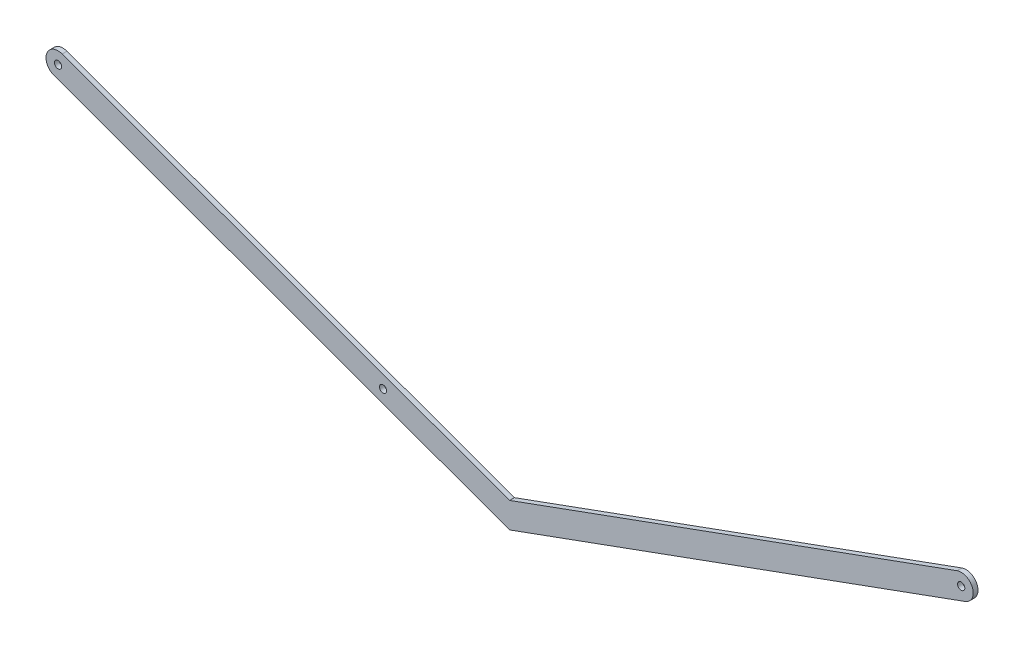
ISO-10303-21;
HEADER;
FILE_DESCRIPTION(('STEP AP214'),'2;1');
FILE_NAME('part.step','',(''),(''),'','','');
FILE_SCHEMA(('AUTOMOTIVE_DESIGN { 1 0 10303 214 1 1 1 1 }'));
ENDSEC;
DATA;
#1=APPLICATION_CONTEXT('core data for automotive mechanical design processes');
#2=APPLICATION_PROTOCOL_DEFINITION('international standard','automotive_design',2000,#1);
#3=PRODUCT_CONTEXT('',#1,'mechanical');
#4=PRODUCT('Part','Part','',(#3));
#5=PRODUCT_RELATED_PRODUCT_CATEGORY('part','',(#4));
#6=PRODUCT_DEFINITION_FORMATION('','',#4);
#7=PRODUCT_DEFINITION_CONTEXT('part definition',#1,'design');
#8=PRODUCT_DEFINITION('design','',#6,#7);
#9=PRODUCT_DEFINITION_SHAPE('','',#8);
#10=(LENGTH_UNIT() NAMED_UNIT(*) SI_UNIT(.MILLI.,.METRE.));
#11=(NAMED_UNIT(*) PLANE_ANGLE_UNIT() SI_UNIT($,.RADIAN.));
#12=(NAMED_UNIT(*) SI_UNIT($,.STERADIAN.) SOLID_ANGLE_UNIT());
#13=UNCERTAINTY_MEASURE_WITH_UNIT(LENGTH_MEASURE(1.E-05),#10,'distance_accuracy_value','');
#14=(GEOMETRIC_REPRESENTATION_CONTEXT(3) GLOBAL_UNCERTAINTY_ASSIGNED_CONTEXT((#13)) GLOBAL_UNIT_ASSIGNED_CONTEXT((#10,
#11,#12)) REPRESENTATION_CONTEXT('',''));
#15=CARTESIAN_POINT('',(0.,0.,0.));
#16=DIRECTION('',(0.,0.,1.));
#17=DIRECTION('',(1.,0.,0.));
#18=AXIS2_PLACEMENT_3D('',#15,#16,#17);
#19=CARTESIAN_POINT('',(596.9,0.,3.175));
#20=DIRECTION('',(0.,0.,1.));
#21=DIRECTION('',(1.,0.,0.));
#22=AXIS2_PLACEMENT_3D('',#19,#20,#21);
#23=PLANE('',#22);
#24=CARTESIAN_POINT('',(596.9,0.,3.175));
#25=DIRECTION('',(0.,0.,1.));
#26=DIRECTION('',(1.,0.,0.));
#27=AXIS2_PLACEMENT_3D('',#24,#25,#26);
#28=CIRCLE('',#27,4.76250000000001);
#29=CARTESIAN_POINT('',(601.6625,0.,3.175));
#30=VERTEX_POINT('',#29);
#31=EDGE_CURVE('E186',#30,#30,#28,.T.);
#32=ORIENTED_EDGE('',*,*,#31,.F.);
#33=EDGE_LOOP('',(#32));
#34=FACE_BOUND('',#33,.T.);
#35=CARTESIAN_POINT('',(596.9,0.,3.175));
#36=DIRECTION('',(0.,0.,1.));
#37=DIRECTION('',(1.,0.,0.));
#38=AXIS2_PLACEMENT_3D('',#35,#36,#37);
#39=CIRCLE('',#38,15.8749999999999);
#40=CARTESIAN_POINT('',(602.329569775295,-14.9176203549762,3.175));
#41=VERTEX_POINT('',#40);
#42=CARTESIAN_POINT('',(591.470430224705,14.9176203549763,3.175));
#43=VERTEX_POINT('',#42);
#44=EDGE_CURVE('E131',#41,#43,#39,.T.);
#45=ORIENTED_EDGE('',*,*,#44,.T.);
#46=DIRECTION('',(-0.939692620785908,-0.342020143325669,0.));
#47=VECTOR('',#46,1.);
#48=CARTESIAN_POINT('',(0.,-200.360010695442,3.175));
#49=LINE('',#48,#47);
#50=CARTESIAN_POINT('',(0.,-200.360010695442,3.175));
#51=VERTEX_POINT('',#50);
#52=EDGE_CURVE('E89',#43,#51,#49,.T.);
#53=ORIENTED_EDGE('',*,*,#52,.T.);
#54=DIRECTION('',(-0.939692620785908,0.342020143325669,0.));
#55=VECTOR('',#54,1.);
#56=CARTESIAN_POINT('',(-591.470430224705,14.9176203549763,3.175));
#57=LINE('',#56,#55);
#58=CARTESIAN_POINT('',(-591.470430224705,14.9176203549763,3.175));
#59=VERTEX_POINT('',#58);
#60=EDGE_CURVE('E102',#51,#59,#57,.T.);
#61=ORIENTED_EDGE('',*,*,#60,.T.);
#62=CARTESIAN_POINT('',(-596.9,0.,3.175));
#63=DIRECTION('',(0.,0.,1.));
#64=DIRECTION('',(1.,0.,0.));
#65=AXIS2_PLACEMENT_3D('',#62,#63,#64);
#66=CIRCLE('',#65,15.875);
#67=CARTESIAN_POINT('',(-602.329569775295,-14.9176203549763,3.175));
#68=VERTEX_POINT('',#67);
#69=EDGE_CURVE('E96',#59,#68,#66,.T.);
#70=ORIENTED_EDGE('',*,*,#69,.T.);
#71=DIRECTION('',(0.939692620785908,-0.342020143325669,0.));
#72=VECTOR('',#71,1.);
#73=CARTESIAN_POINT('',(-602.329569775295,-14.9176203549763,3.175));
#74=LINE('',#73,#72);
#75=CARTESIAN_POINT('',(0.,-234.147654971552,3.175));
#76=VERTEX_POINT('',#75);
#77=EDGE_CURVE('E100',#68,#76,#74,.T.);
#78=ORIENTED_EDGE('',*,*,#77,.T.);
#79=DIRECTION('',(0.939692620785908,0.342020143325669,0.));
#80=VECTOR('',#79,1.);
#81=CARTESIAN_POINT('',(0.,-234.147654971552,3.175));
#82=LINE('',#81,#80);
#83=EDGE_CURVE('E52',#76,#41,#82,.T.);
#84=ORIENTED_EDGE('',*,*,#83,.T.);
#85=EDGE_LOOP('',(#45,#53,#61,#70,#78,#84));
#86=FACE_BOUND('',#85,.T.);
#87=CARTESIAN_POINT('',(-596.9,0.,3.175));
#88=DIRECTION('',(0.,0.,1.));
#89=DIRECTION('',(1.,0.,0.));
#90=AXIS2_PLACEMENT_3D('',#87,#88,#89);
#91=CIRCLE('',#90,4.76250000000001);
#92=CARTESIAN_POINT('',(-592.1375,0.,3.175));
#93=VERTEX_POINT('',#92);
#94=EDGE_CURVE('E124',#93,#93,#91,.T.);
#95=ORIENTED_EDGE('',*,*,#94,.F.);
#96=EDGE_LOOP('',(#95));
#97=FACE_BOUND('',#96,.T.);
#98=CARTESIAN_POINT('',(-167.272533776683,-156.371609528496,3.175));
#99=DIRECTION('',(0.,0.,1.));
#100=DIRECTION('',(1.,0.,0.));
#101=AXIS2_PLACEMENT_3D('',#98,#99,#100);
#102=CIRCLE('',#101,4.76250000000001);
#103=CARTESIAN_POINT('',(-162.510033776683,-156.371609528496,3.175));
#104=VERTEX_POINT('',#103);
#105=EDGE_CURVE('E177',#104,#104,#102,.T.);
#106=ORIENTED_EDGE('',*,*,#105,.F.);
#107=EDGE_LOOP('',(#106));
#108=FACE_BOUND('',#107,.T.);
#109=ADVANCED_FACE('F35',(#34,#86,#97,#108),#23,.T.);
#110=CARTESIAN_POINT('',(596.9,0.,-3.175));
#111=DIRECTION('',(0.,0.,1.));
#112=DIRECTION('',(1.,0.,0.));
#113=AXIS2_PLACEMENT_3D('',#110,#111,#112);
#114=PLANE('',#113);
#115=CARTESIAN_POINT('',(596.9,0.,-3.175));
#116=DIRECTION('',(0.,0.,1.));
#117=DIRECTION('',(1.,0.,0.));
#118=AXIS2_PLACEMENT_3D('',#115,#116,#117);
#119=CIRCLE('',#118,15.8749999999999);
#120=CARTESIAN_POINT('',(602.329569775295,-14.9176203549762,-3.175));
#121=VERTEX_POINT('',#120);
#122=CARTESIAN_POINT('',(591.470430224705,14.9176203549763,-3.175));
#123=VERTEX_POINT('',#122);
#124=EDGE_CURVE('E120',#121,#123,#119,.T.);
#125=ORIENTED_EDGE('',*,*,#124,.F.);
#126=DIRECTION('',(0.939692620785908,0.342020143325669,0.));
#127=VECTOR('',#126,1.);
#128=CARTESIAN_POINT('',(0.,-234.147654971552,-3.175));
#129=LINE('',#128,#127);
#130=CARTESIAN_POINT('',(0.,-234.147654971552,-3.175));
#131=VERTEX_POINT('',#130);
#132=EDGE_CURVE('E81',#131,#121,#129,.T.);
#133=ORIENTED_EDGE('',*,*,#132,.F.);
#134=DIRECTION('',(0.939692620785908,-0.342020143325669,0.));
#135=VECTOR('',#134,1.);
#136=CARTESIAN_POINT('',(-602.329569775295,-14.9176203549763,-3.175));
#137=LINE('',#136,#135);
#138=CARTESIAN_POINT('',(-602.329569775295,-14.9176203549763,-3.175));
#139=VERTEX_POINT('',#138);
#140=EDGE_CURVE('E75',#139,#131,#137,.T.);
#141=ORIENTED_EDGE('',*,*,#140,.F.);
#142=CARTESIAN_POINT('',(-596.9,0.,-3.175));
#143=DIRECTION('',(0.,0.,1.));
#144=DIRECTION('',(1.,0.,0.));
#145=AXIS2_PLACEMENT_3D('',#142,#143,#144);
#146=CIRCLE('',#145,15.875);
#147=CARTESIAN_POINT('',(-591.470430224705,14.9176203549763,-3.175));
#148=VERTEX_POINT('',#147);
#149=EDGE_CURVE('E110',#148,#139,#146,.T.);
#150=ORIENTED_EDGE('',*,*,#149,.F.);
#151=DIRECTION('',(-0.939692620785908,0.342020143325669,0.));
#152=VECTOR('',#151,1.);
#153=CARTESIAN_POINT('',(-591.470430224705,14.9176203549763,-3.175));
#154=LINE('',#153,#152);
#155=CARTESIAN_POINT('',(0.,-200.360010695442,-3.175));
#156=VERTEX_POINT('',#155);
#157=EDGE_CURVE('E126',#156,#148,#154,.T.);
#158=ORIENTED_EDGE('',*,*,#157,.F.);
#159=DIRECTION('',(-0.939692620785908,-0.342020143325669,0.));
#160=VECTOR('',#159,1.);
#161=CARTESIAN_POINT('',(0.,-200.360010695442,-3.175));
#162=LINE('',#161,#160);
#163=EDGE_CURVE('E123',#123,#156,#162,.T.);
#164=ORIENTED_EDGE('',*,*,#163,.F.);
#165=EDGE_LOOP('',(#125,#133,#141,#150,#158,#164));
#166=FACE_BOUND('',#165,.T.);
#167=CARTESIAN_POINT('',(-596.9,0.,-3.175));
#168=DIRECTION('',(0.,0.,1.));
#169=DIRECTION('',(1.,0.,0.));
#170=AXIS2_PLACEMENT_3D('',#167,#168,#169);
#171=CIRCLE('',#170,4.76250000000001);
#172=CARTESIAN_POINT('',(-592.1375,0.,-3.175));
#173=VERTEX_POINT('',#172);
#174=EDGE_CURVE('E189',#173,#173,#171,.T.);
#175=ORIENTED_EDGE('',*,*,#174,.T.);
#176=EDGE_LOOP('',(#175));
#177=FACE_BOUND('',#176,.T.);
#178=CARTESIAN_POINT('',(596.9,0.,-3.175));
#179=DIRECTION('',(0.,0.,1.));
#180=DIRECTION('',(1.,0.,0.));
#181=AXIS2_PLACEMENT_3D('',#178,#179,#180);
#182=CIRCLE('',#181,4.76250000000001);
#183=CARTESIAN_POINT('',(601.6625,0.,-3.175));
#184=VERTEX_POINT('',#183);
#185=EDGE_CURVE('E183',#184,#184,#182,.T.);
#186=ORIENTED_EDGE('',*,*,#185,.T.);
#187=EDGE_LOOP('',(#186));
#188=FACE_BOUND('',#187,.T.);
#189=CARTESIAN_POINT('',(-167.272533776683,-156.371609528496,-3.175));
#190=DIRECTION('',(0.,0.,1.));
#191=DIRECTION('',(1.,0.,0.));
#192=AXIS2_PLACEMENT_3D('',#189,#190,#191);
#193=CIRCLE('',#192,4.76250000000001);
#194=CARTESIAN_POINT('',(-162.510033776683,-156.371609528496,-3.175));
#195=VERTEX_POINT('',#194);
#196=EDGE_CURVE('E180',#195,#195,#193,.T.);
#197=ORIENTED_EDGE('',*,*,#196,.T.);
#198=EDGE_LOOP('',(#197));
#199=FACE_BOUND('',#198,.T.);
#200=ADVANCED_FACE('F140',(#166,#177,#188,#199),#114,.F.);
#201=CARTESIAN_POINT('',(596.9,0.,3.175));
#202=DIRECTION('',(0.,0.,-1.));
#203=DIRECTION('',(-1.,0.,0.));
#204=AXIS2_PLACEMENT_3D('',#201,#202,#203);
#205=CYLINDRICAL_SURFACE('',#204,15.8749999999999);
#206=ORIENTED_EDGE('',*,*,#124,.T.);
#207=DIRECTION('',(0.,0.,-1.));
#208=VECTOR('',#207,1.);
#209=CARTESIAN_POINT('',(591.470430224705,14.9176203549763,3.175));
#210=LINE('',#209,#208);
#211=EDGE_CURVE('E11',#43,#123,#210,.T.);
#212=ORIENTED_EDGE('',*,*,#211,.F.);
#213=ORIENTED_EDGE('',*,*,#44,.F.);
#214=DIRECTION('',(0.,0.,-1.));
#215=VECTOR('',#214,1.);
#216=CARTESIAN_POINT('',(602.329569775295,-14.9176203549762,3.175));
#217=LINE('',#216,#215);
#218=EDGE_CURVE('E116',#41,#121,#217,.T.);
#219=ORIENTED_EDGE('',*,*,#218,.T.);
#220=EDGE_LOOP('',(#206,#212,#213,#219));
#221=FACE_BOUND('',#220,.T.);
#222=ADVANCED_FACE('F37',(#221),#205,.T.);
#223=CARTESIAN_POINT('',(0.,-200.360010695442,3.175));
#224=DIRECTION('',(0.342020143325669,-0.939692620785908,0.));
#225=DIRECTION('',(0.939692620785908,0.342020143325669,0.));
#226=AXIS2_PLACEMENT_3D('',#223,#224,#225);
#227=PLANE('',#226);
#228=ORIENTED_EDGE('',*,*,#163,.T.);
#229=DIRECTION('',(0.,0.,-1.));
#230=VECTOR('',#229,1.);
#231=CARTESIAN_POINT('',(0.,-200.360010695442,3.175));
#232=LINE('',#231,#230);
#233=EDGE_CURVE('E44',#51,#156,#232,.T.);
#234=ORIENTED_EDGE('',*,*,#233,.F.);
#235=ORIENTED_EDGE('',*,*,#52,.F.);
#236=ORIENTED_EDGE('',*,*,#211,.T.);
#237=EDGE_LOOP('',(#228,#234,#235,#236));
#238=FACE_BOUND('',#237,.T.);
#239=ADVANCED_FACE('F239',(#238),#227,.F.);
#240=CARTESIAN_POINT('',(-591.470430224705,14.9176203549763,3.175));
#241=DIRECTION('',(-0.342020143325669,-0.939692620785908,0.));
#242=DIRECTION('',(0.939692620785908,-0.342020143325669,0.));
#243=AXIS2_PLACEMENT_3D('',#240,#241,#242);
#244=PLANE('',#243);
#245=ORIENTED_EDGE('',*,*,#157,.T.);
#246=DIRECTION('',(0.,0.,-1.));
#247=VECTOR('',#246,1.);
#248=CARTESIAN_POINT('',(-591.470430224705,14.9176203549763,3.175));
#249=LINE('',#248,#247);
#250=EDGE_CURVE('E111',#59,#148,#249,.T.);
#251=ORIENTED_EDGE('',*,*,#250,.F.);
#252=ORIENTED_EDGE('',*,*,#60,.F.);
#253=ORIENTED_EDGE('',*,*,#233,.T.);
#254=EDGE_LOOP('',(#245,#251,#252,#253));
#255=FACE_BOUND('',#254,.T.);
#256=ADVANCED_FACE('F137',(#255),#244,.F.);
#257=CARTESIAN_POINT('',(-596.9,0.,3.175));
#258=DIRECTION('',(0.,0.,-1.));
#259=DIRECTION('',(-1.,0.,0.));
#260=AXIS2_PLACEMENT_3D('',#257,#258,#259);
#261=CYLINDRICAL_SURFACE('',#260,15.875);
#262=ORIENTED_EDGE('',*,*,#149,.T.);
#263=DIRECTION('',(0.,0.,-1.));
#264=VECTOR('',#263,1.);
#265=CARTESIAN_POINT('',(-602.329569775295,-14.9176203549763,3.175));
#266=LINE('',#265,#264);
#267=EDGE_CURVE('E107',#68,#139,#266,.T.);
#268=ORIENTED_EDGE('',*,*,#267,.F.);
#269=ORIENTED_EDGE('',*,*,#69,.F.);
#270=ORIENTED_EDGE('',*,*,#250,.T.);
#271=EDGE_LOOP('',(#262,#268,#269,#270));
#272=FACE_BOUND('',#271,.T.);
#273=ADVANCED_FACE('F108',(#272),#261,.T.);
#274=CARTESIAN_POINT('',(-602.329569775295,-14.9176203549763,3.175));
#275=DIRECTION('',(0.342020143325669,0.939692620785908,0.));
#276=DIRECTION('',(-0.939692620785908,0.342020143325669,0.));
#277=AXIS2_PLACEMENT_3D('',#274,#275,#276);
#278=PLANE('',#277);
#279=ORIENTED_EDGE('',*,*,#140,.T.);
#280=DIRECTION('',(0.,0.,-1.));
#281=VECTOR('',#280,1.);
#282=CARTESIAN_POINT('',(0.,-234.147654971552,3.175));
#283=LINE('',#282,#281);
#284=EDGE_CURVE('E112',#76,#131,#283,.T.);
#285=ORIENTED_EDGE('',*,*,#284,.F.);
#286=ORIENTED_EDGE('',*,*,#77,.F.);
#287=ORIENTED_EDGE('',*,*,#267,.T.);
#288=EDGE_LOOP('',(#279,#285,#286,#287));
#289=FACE_BOUND('',#288,.T.);
#290=ADVANCED_FACE('F114',(#289),#278,.F.);
#291=CARTESIAN_POINT('',(0.,-234.147654971552,3.175));
#292=DIRECTION('',(-0.342020143325669,0.939692620785908,0.));
#293=DIRECTION('',(-0.939692620785908,-0.342020143325669,0.));
#294=AXIS2_PLACEMENT_3D('',#291,#292,#293);
#295=PLANE('',#294);
#296=ORIENTED_EDGE('',*,*,#132,.T.);
#297=ORIENTED_EDGE('',*,*,#218,.F.);
#298=ORIENTED_EDGE('',*,*,#83,.F.);
#299=ORIENTED_EDGE('',*,*,#284,.T.);
#300=EDGE_LOOP('',(#296,#297,#298,#299));
#301=FACE_BOUND('',#300,.T.);
#302=ADVANCED_FACE('F145',(#301),#295,.F.);
#303=CARTESIAN_POINT('',(-596.9,0.,3.175));
#304=DIRECTION('',(0.,0.,-1.));
#305=DIRECTION('',(-1.,0.,0.));
#306=AXIS2_PLACEMENT_3D('',#303,#304,#305);
#307=CYLINDRICAL_SURFACE('',#306,4.76250000000001);
#308=ORIENTED_EDGE('',*,*,#94,.T.);
#309=EDGE_LOOP('',(#308));
#310=FACE_BOUND('',#309,.T.);
#311=ORIENTED_EDGE('',*,*,#174,.F.);
#312=EDGE_LOOP('',(#311));
#313=FACE_BOUND('',#312,.T.);
#314=ADVANCED_FACE('F147',(#310,#313),#307,.F.);
#315=CARTESIAN_POINT('',(596.9,0.,3.175));
#316=DIRECTION('',(0.,0.,-1.));
#317=DIRECTION('',(-1.,0.,0.));
#318=AXIS2_PLACEMENT_3D('',#315,#316,#317);
#319=CYLINDRICAL_SURFACE('',#318,4.76250000000001);
#320=ORIENTED_EDGE('',*,*,#31,.T.);
#321=EDGE_LOOP('',(#320));
#322=FACE_BOUND('',#321,.T.);
#323=ORIENTED_EDGE('',*,*,#185,.F.);
#324=EDGE_LOOP('',(#323));
#325=FACE_BOUND('',#324,.T.);
#326=ADVANCED_FACE('F153',(#322,#325),#319,.F.);
#327=CARTESIAN_POINT('',(-167.272533776683,-156.371609528496,3.175));
#328=DIRECTION('',(0.,0.,-1.));
#329=DIRECTION('',(-1.,0.,0.));
#330=AXIS2_PLACEMENT_3D('',#327,#328,#329);
#331=CYLINDRICAL_SURFACE('',#330,4.76250000000001);
#332=ORIENTED_EDGE('',*,*,#105,.T.);
#333=EDGE_LOOP('',(#332));
#334=FACE_BOUND('',#333,.T.);
#335=ORIENTED_EDGE('',*,*,#196,.F.);
#336=EDGE_LOOP('',(#335));
#337=FACE_BOUND('',#336,.T.);
#338=ADVANCED_FACE('F168',(#334,#337),#331,.F.);
#339=CLOSED_SHELL('',(#109,#200,#222,#239,#256,#273,#290,#302,#314,#326,#338));
#340=MANIFOLD_SOLID_BREP('B2',#339);
#341=ADVANCED_BREP_SHAPE_REPRESENTATION('',(#18,#340),#14);
#342=SHAPE_DEFINITION_REPRESENTATION(#9,#341);
ENDSEC;
END-ISO-10303-21;
